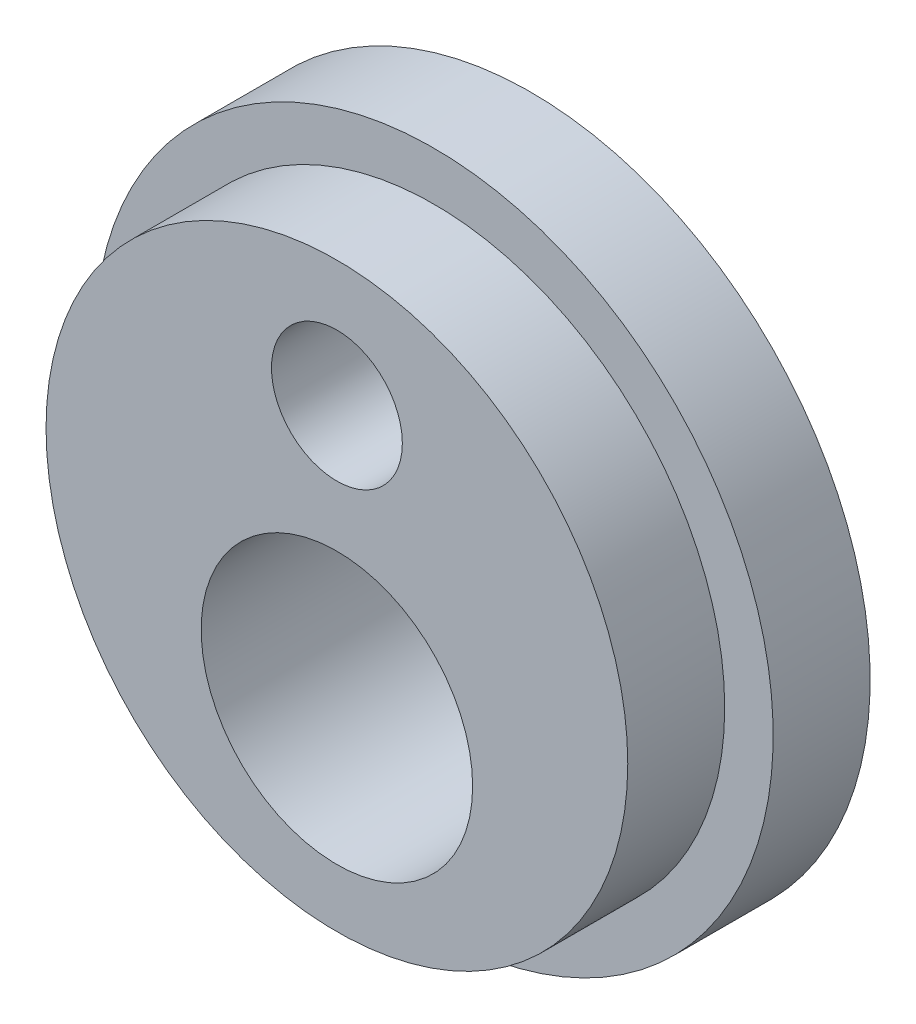
ISO-10303-21;
HEADER;
FILE_DESCRIPTION(('STEP AP214'),'2;1');
FILE_NAME('part.step','',(''),(''),'','','');
FILE_SCHEMA(('AUTOMOTIVE_DESIGN { 1 0 10303 214 1 1 1 1 }'));
ENDSEC;
DATA;
#1=APPLICATION_CONTEXT('core data for automotive mechanical design processes');
#2=APPLICATION_PROTOCOL_DEFINITION('international standard','automotive_design',2000,#1);
#3=PRODUCT_CONTEXT('',#1,'mechanical');
#4=PRODUCT('Part','Part','',(#3));
#5=PRODUCT_RELATED_PRODUCT_CATEGORY('part','',(#4));
#6=PRODUCT_DEFINITION_FORMATION('','',#4);
#7=PRODUCT_DEFINITION_CONTEXT('part definition',#1,'design');
#8=PRODUCT_DEFINITION('design','',#6,#7);
#9=PRODUCT_DEFINITION_SHAPE('','',#8);
#10=(LENGTH_UNIT() NAMED_UNIT(*) SI_UNIT(.MILLI.,.METRE.));
#11=(NAMED_UNIT(*) PLANE_ANGLE_UNIT() SI_UNIT($,.RADIAN.));
#12=(NAMED_UNIT(*) SI_UNIT($,.STERADIAN.) SOLID_ANGLE_UNIT());
#13=UNCERTAINTY_MEASURE_WITH_UNIT(LENGTH_MEASURE(1.E-05),#10,'distance_accuracy_value','');
#14=(GEOMETRIC_REPRESENTATION_CONTEXT(3) GLOBAL_UNCERTAINTY_ASSIGNED_CONTEXT((#13)) GLOBAL_UNIT_ASSIGNED_CONTEXT((#10,
#11,#12)) REPRESENTATION_CONTEXT('',''));
#15=CARTESIAN_POINT('',(0.,0.,0.));
#16=DIRECTION('',(0.,0.,1.));
#17=DIRECTION('',(1.,0.,0.));
#18=AXIS2_PLACEMENT_3D('',#15,#16,#17);
#19=CARTESIAN_POINT('',(0.,-1.66533453693773E-13,12.7));
#20=DIRECTION('',(0.,0.,-0.999999999999999));
#21=DIRECTION('',(-1.,0.,0.));
#22=AXIS2_PLACEMENT_3D('',#19,#20,#21);
#23=CYLINDRICAL_SURFACE('',#22,44.45);
#24=CARTESIAN_POINT('',(0.,-1.66533453693773E-13,12.7));
#25=DIRECTION('',(0.,0.,0.999999999999999));
#26=DIRECTION('',(1.,0.,0.));
#27=AXIS2_PLACEMENT_3D('',#24,#25,#26);
#28=CIRCLE('',#27,44.45);
#29=CARTESIAN_POINT('',(-44.45,-1.66533453693774E-13,12.7));
#30=VERTEX_POINT('',#29);
#31=EDGE_CURVE('E39',#30,#30,#28,.T.);
#32=CARTESIAN_POINT('',(0.,0.,0.));
#33=DIRECTION('',(0.,0.,0.999999999999999));
#34=DIRECTION('',(1.,0.,0.));
#35=AXIS2_PLACEMENT_3D('',#32,#33,#34);
#36=CIRCLE('',#35,44.45);
#37=CARTESIAN_POINT('',(-44.45,-1.66533453693774E-13,0.));
#38=VERTEX_POINT('',#37);
#39=EDGE_CURVE('E44',#38,#38,#36,.T.);
#40=CARTESIAN_POINT('',(-44.45,-1.66533453693774E-13,12.7));
#41=CARTESIAN_POINT('',(-44.45,-1.66533453693774E-13,12.5677083333333));
#42=CARTESIAN_POINT('',(-44.45,-1.66533453693774E-13,12.4354166666667));
#43=CARTESIAN_POINT('',(-44.45,-1.66533453693774E-13,12.1708333333333));
#44=CARTESIAN_POINT('',(-44.45,-1.66533453693774E-13,12.0385416666667));
#45=CARTESIAN_POINT('',(-44.45,-1.66533453693774E-13,11.7739583333333));
#46=CARTESIAN_POINT('',(-44.45,-1.66533453693774E-13,11.6416666666667));
#47=CARTESIAN_POINT('',(-44.45,-1.66533453693774E-13,11.3770833333333));
#48=CARTESIAN_POINT('',(-44.45,-1.66533453693774E-13,11.2447916666667));
#49=CARTESIAN_POINT('',(-44.45,-1.66533453693774E-13,10.9802083333333));
#50=CARTESIAN_POINT('',(-44.45,-1.66533453693774E-13,10.8479166666667));
#51=CARTESIAN_POINT('',(-44.45,-1.66533453693774E-13,10.5833333333333));
#52=CARTESIAN_POINT('',(-44.45,-1.66533453693774E-13,10.4510416666667));
#53=CARTESIAN_POINT('',(-44.45,-1.66533453693774E-13,10.1864583333333));
#54=CARTESIAN_POINT('',(-44.45,-1.66533453693774E-13,10.0541666666667));
#55=CARTESIAN_POINT('',(-44.45,-1.66533453693774E-13,9.78958333333334));
#56=CARTESIAN_POINT('',(-44.45,-1.66533453693774E-13,9.65729166666667));
#57=CARTESIAN_POINT('',(-44.45,-1.66533453693774E-13,9.39270833333333));
#58=CARTESIAN_POINT('',(-44.45,-1.66533453693774E-13,9.26041666666667));
#59=CARTESIAN_POINT('',(-44.45,-1.66533453693774E-13,8.99583333333334));
#60=CARTESIAN_POINT('',(-44.45,-1.66533453693774E-13,8.86354166666667));
#61=CARTESIAN_POINT('',(-44.45,-1.66533453693774E-13,8.59895833333334));
#62=CARTESIAN_POINT('',(-44.45,-1.66533453693774E-13,8.46666666666667));
#63=CARTESIAN_POINT('',(-44.45,-1.66533453693774E-13,8.20208333333333));
#64=CARTESIAN_POINT('',(-44.45,-1.66533453693774E-13,8.06979166666667));
#65=CARTESIAN_POINT('',(-44.45,-1.66533453693774E-13,7.80520833333333));
#66=CARTESIAN_POINT('',(-44.45,-1.66533453693774E-13,7.67291666666667));
#67=CARTESIAN_POINT('',(-44.45,-1.66533453693774E-13,7.40833333333333));
#68=CARTESIAN_POINT('',(-44.45,-1.66533453693774E-13,7.27604166666667));
#69=CARTESIAN_POINT('',(-44.45,-1.66533453693774E-13,7.01145833333333));
#70=CARTESIAN_POINT('',(-44.45,-1.66533453693774E-13,6.87916666666667));
#71=CARTESIAN_POINT('',(-44.45,-1.66533453693774E-13,6.61458333333333));
#72=CARTESIAN_POINT('',(-44.45,-1.66533453693774E-13,6.48229166666667));
#73=CARTESIAN_POINT('',(-44.45,-1.66533453693774E-13,6.21770833333333));
#74=CARTESIAN_POINT('',(-44.45,-1.66533453693774E-13,6.08541666666667));
#75=CARTESIAN_POINT('',(-44.45,-1.66533453693774E-13,5.82083333333333));
#76=CARTESIAN_POINT('',(-44.45,-1.66533453693774E-13,5.68854166666667));
#77=CARTESIAN_POINT('',(-44.45,-1.66533453693774E-13,5.42395833333333));
#78=CARTESIAN_POINT('',(-44.45,-1.66533453693774E-13,5.29166666666667));
#79=CARTESIAN_POINT('',(-44.45,-1.66533453693774E-13,5.02708333333333));
#80=CARTESIAN_POINT('',(-44.45,-1.66533453693774E-13,4.89479166666667));
#81=CARTESIAN_POINT('',(-44.45,-1.66533453693774E-13,4.63020833333333));
#82=CARTESIAN_POINT('',(-44.45,-1.66533453693774E-13,4.49791666666667));
#83=CARTESIAN_POINT('',(-44.45,-1.66533453693774E-13,4.23333333333333));
#84=CARTESIAN_POINT('',(-44.45,-1.66533453693774E-13,4.10104166666667));
#85=CARTESIAN_POINT('',(-44.45,-1.66533453693774E-13,3.83645833333333));
#86=CARTESIAN_POINT('',(-44.45,-1.66533453693774E-13,3.70416666666667));
#87=CARTESIAN_POINT('',(-44.45,-1.66533453693774E-13,3.43958333333333));
#88=CARTESIAN_POINT('',(-44.45,-1.66533453693774E-13,3.30729166666667));
#89=CARTESIAN_POINT('',(-44.45,-1.66533453693774E-13,3.04270833333333));
#90=CARTESIAN_POINT('',(-44.45,-1.66533453693774E-13,2.91041666666667));
#91=CARTESIAN_POINT('',(-44.45,-1.66533453693774E-13,2.64583333333333));
#92=CARTESIAN_POINT('',(-44.45,-1.66533453693774E-13,2.51354166666667));
#93=CARTESIAN_POINT('',(-44.45,-1.66533453693774E-13,2.24895833333333));
#94=CARTESIAN_POINT('',(-44.45,-1.66533453693774E-13,2.11666666666666));
#95=CARTESIAN_POINT('',(-44.45,-1.66533453693774E-13,1.85208333333333));
#96=CARTESIAN_POINT('',(-44.45,-1.66533453693774E-13,1.71979166666667));
#97=CARTESIAN_POINT('',(-44.45,-1.66533453693774E-13,1.45520833333333));
#98=CARTESIAN_POINT('',(-44.45,-1.66533453693774E-13,1.32291666666666));
#99=CARTESIAN_POINT('',(-44.45,-1.66533453693774E-13,1.05833333333333));
#100=CARTESIAN_POINT('',(-44.45,-1.66533453693774E-13,0.926041666666665));
#101=CARTESIAN_POINT('',(-44.45,-1.66533453693774E-13,0.661458333333332));
#102=CARTESIAN_POINT('',(-44.45,-1.66533453693774E-13,0.529166666666665));
#103=CARTESIAN_POINT('',(-44.45,-1.66533453693774E-13,0.264583333333331));
#104=CARTESIAN_POINT('',(-44.45,-1.66533453693774E-13,0.132291666666665));
#105=CARTESIAN_POINT('',(-44.45,-1.66533453693774E-13,0.));
#106=B_SPLINE_CURVE_WITH_KNOTS('',3,(#40,#41,#42,#43,#44,#45,#46,#47,#48,#49,#50,#51,#52,#53,
#54,#55,#56,#57,#58,#59,#60,#61,#62,#63,#64,#65,#66,#67,#68,#69,#70,#71,#72,#73,#74,#75,#76,#77,
#78,#79,#80,#81,#82,#83,#84,#85,#86,#87,#88,#89,#90,#91,#92,#93,#94,#95,#96,#97,#98,#99,#100,
#101,#102,#103,#104,#105),.UNSPECIFIED.,.F.,.F.,(4,2,2,2,2,2,2,2,2,2,2,2,2,2,2,2,2,2,2,2,2,2,2,
2,2,2,2,2,2,2,2,2,4),(0.,0.396875,0.793749999999999,1.190625,1.5875,1.984375,2.38125,2.778125,
3.175,3.571875,3.96875,4.365625,4.7625,5.159375,5.55625,5.953125,6.35,6.746875,7.14375,7.540625,
7.9375,8.334375,8.73125,9.128125,9.525,9.921875,10.31875,10.715625,11.1125,11.509375,11.90625,
12.303125,12.7),.UNSPECIFIED.);
#107=EDGE_CURVE('BSEAM32',#30,#38,#106,.T.);
#108=ORIENTED_EDGE('',*,*,#31,.F.);
#109=ORIENTED_EDGE('',*,*,#39,.T.);
#110=ORIENTED_EDGE('',*,*,#107,.T.);
#111=ORIENTED_EDGE('',*,*,#107,.F.);
#112=EDGE_LOOP('',(#108,#110,#109,#111));
#113=FACE_BOUND('',#112,.T.);
#114=ADVANCED_FACE('F32',(#113),#23,.T.);
#115=CARTESIAN_POINT('',(0.,-1.66533453693773E-13,12.7));
#116=DIRECTION('',(0.,0.,0.999999999999999));
#117=DIRECTION('',(1.,0.,0.));
#118=AXIS2_PLACEMENT_3D('',#115,#116,#117);
#119=PLANE('',#118);
#120=CARTESIAN_POINT('',(0.,-1.66533453693773E-13,12.7));
#121=DIRECTION('',(0.,0.,0.999999999999999));
#122=DIRECTION('',(1.,0.,0.));
#123=AXIS2_PLACEMENT_3D('',#120,#121,#122);
#124=CIRCLE('',#123,38.1);
#125=CARTESIAN_POINT('',(-38.1,-1.66533453693774E-13,12.7));
#126=VERTEX_POINT('',#125);
#127=EDGE_CURVE('E10',#126,#126,#124,.T.);
#128=ORIENTED_EDGE('',*,*,#127,.F.);
#129=EDGE_LOOP('',(#128));
#130=FACE_BOUND('',#129,.T.);
#131=ORIENTED_EDGE('',*,*,#31,.T.);
#132=EDGE_LOOP('',(#131));
#133=FACE_BOUND('',#132,.T.);
#134=ADVANCED_FACE('F91',(#130,#133),#119,.T.);
#135=CARTESIAN_POINT('',(0.,0.,0.));
#136=DIRECTION('',(0.,0.,0.999999999999999));
#137=DIRECTION('',(1.,0.,0.));
#138=AXIS2_PLACEMENT_3D('',#135,#136,#137);
#139=PLANE('',#138);
#140=CARTESIAN_POINT('',(-27.94,-12.7,0.));
#141=DIRECTION('',(0.,0.,-0.999999999999999));
#142=DIRECTION('',(-1.,0.,0.));
#143=AXIS2_PLACEMENT_3D('',#140,#141,#142);
#144=CIRCLE('',#143,3.175);
#145=CARTESIAN_POINT('',(-31.1149999999999,-12.7,0.));
#146=VERTEX_POINT('',#145);
#147=EDGE_CURVE('E72',#146,#146,#144,.T.);
#148=ORIENTED_EDGE('',*,*,#147,.F.);
#149=EDGE_LOOP('',(#148));
#150=FACE_BOUND('',#149,.T.);
#151=CARTESIAN_POINT('',(27.94,-12.6999999999999,0.));
#152=DIRECTION('',(0.,0.,-0.999999999999999));
#153=DIRECTION('',(-1.,0.,0.));
#154=AXIS2_PLACEMENT_3D('',#151,#152,#153);
#155=CIRCLE('',#154,3.175);
#156=CARTESIAN_POINT('',(24.765,-12.7,0.));
#157=VERTEX_POINT('',#156);
#158=EDGE_CURVE('E66',#157,#157,#155,.T.);
#159=ORIENTED_EDGE('',*,*,#158,.F.);
#160=EDGE_LOOP('',(#159));
#161=FACE_BOUND('',#160,.T.);
#162=CARTESIAN_POINT('',(0.,-12.7,0.));
#163=DIRECTION('',(0.,0.,0.999999999999999));
#164=DIRECTION('',(1.,0.,0.));
#165=AXIS2_PLACEMENT_3D('',#162,#163,#164);
#166=CIRCLE('',#165,17.78);
#167=CARTESIAN_POINT('',(17.78,-12.7,0.));
#168=VERTEX_POINT('',#167);
#169=EDGE_CURVE('E61',#168,#168,#166,.T.);
#170=ORIENTED_EDGE('',*,*,#169,.T.);
#171=EDGE_LOOP('',(#170));
#172=FACE_BOUND('',#171,.T.);
#173=CARTESIAN_POINT('',(0.,21.59,0.));
#174=DIRECTION('',(0.,0.,0.999999999999999));
#175=DIRECTION('',(1.,0.,0.));
#176=AXIS2_PLACEMENT_3D('',#173,#174,#175);
#177=CIRCLE('',#176,8.5725);
#178=CARTESIAN_POINT('',(8.5725,21.59,0.));
#179=VERTEX_POINT('',#178);
#180=EDGE_CURVE('E53',#179,#179,#177,.T.);
#181=ORIENTED_EDGE('',*,*,#180,.T.);
#182=EDGE_LOOP('',(#181));
#183=FACE_BOUND('',#182,.T.);
#184=ORIENTED_EDGE('',*,*,#39,.F.);
#185=EDGE_LOOP('',(#184));
#186=FACE_BOUND('',#185,.T.);
#187=ADVANCED_FACE('F87',(#150,#161,#172,#183,#186),#139,.F.);
#188=CARTESIAN_POINT('',(0.,-1.66533453693773E-13,25.4));
#189=DIRECTION('',(0.,0.,-0.999999999999999));
#190=DIRECTION('',(-1.,0.,0.));
#191=AXIS2_PLACEMENT_3D('',#188,#189,#190);
#192=CYLINDRICAL_SURFACE('',#191,38.1);
#193=CARTESIAN_POINT('',(0.,-1.66533453693773E-13,25.4));
#194=DIRECTION('',(0.,0.,0.999999999999999));
#195=DIRECTION('',(1.,0.,0.));
#196=AXIS2_PLACEMENT_3D('',#193,#194,#195);
#197=CIRCLE('',#196,38.1);
#198=CARTESIAN_POINT('',(-38.1,-1.66533453693774E-13,25.4));
#199=VERTEX_POINT('',#198);
#200=EDGE_CURVE('E47',#199,#199,#197,.T.);
#201=CARTESIAN_POINT('',(-38.1,-1.66533453693774E-13,25.4));
#202=CARTESIAN_POINT('',(-38.1,-1.66533453693774E-13,25.2677083333333));
#203=CARTESIAN_POINT('',(-38.1,-1.66533453693774E-13,25.1354166666667));
#204=CARTESIAN_POINT('',(-38.1,-1.66533453693774E-13,24.8708333333333));
#205=CARTESIAN_POINT('',(-38.1,-1.66533453693774E-13,24.7385416666667));
#206=CARTESIAN_POINT('',(-38.1,-1.66533453693774E-13,24.4739583333333));
#207=CARTESIAN_POINT('',(-38.1,-1.66533453693774E-13,24.3416666666667));
#208=CARTESIAN_POINT('',(-38.1,-1.66533453693774E-13,24.0770833333333));
#209=CARTESIAN_POINT('',(-38.1,-1.66533453693774E-13,23.9447916666667));
#210=CARTESIAN_POINT('',(-38.1,-1.66533453693774E-13,23.6802083333333));
#211=CARTESIAN_POINT('',(-38.1,-1.66533453693774E-13,23.5479166666667));
#212=CARTESIAN_POINT('',(-38.1,-1.66533453693774E-13,23.2833333333333));
#213=CARTESIAN_POINT('',(-38.1,-1.66533453693774E-13,23.1510416666667));
#214=CARTESIAN_POINT('',(-38.1,-1.66533453693774E-13,22.8864583333333));
#215=CARTESIAN_POINT('',(-38.1,-1.66533453693774E-13,22.7541666666667));
#216=CARTESIAN_POINT('',(-38.1,-1.66533453693774E-13,22.4895833333333));
#217=CARTESIAN_POINT('',(-38.1,-1.66533453693774E-13,22.3572916666667));
#218=CARTESIAN_POINT('',(-38.1,-1.66533453693774E-13,22.0927083333333));
#219=CARTESIAN_POINT('',(-38.1,-1.66533453693774E-13,21.9604166666667));
#220=CARTESIAN_POINT('',(-38.1,-1.66533453693774E-13,21.6958333333333));
#221=CARTESIAN_POINT('',(-38.1,-1.66533453693774E-13,21.5635416666667));
#222=CARTESIAN_POINT('',(-38.1,-1.66533453693774E-13,21.2989583333333));
#223=CARTESIAN_POINT('',(-38.1,-1.66533453693774E-13,21.1666666666667));
#224=CARTESIAN_POINT('',(-38.1,-1.66533453693774E-13,20.9020833333333));
#225=CARTESIAN_POINT('',(-38.1,-1.66533453693774E-13,20.7697916666667));
#226=CARTESIAN_POINT('',(-38.1,-1.66533453693774E-13,20.5052083333333));
#227=CARTESIAN_POINT('',(-38.1,-1.66533453693774E-13,20.3729166666667));
#228=CARTESIAN_POINT('',(-38.1,-1.66533453693774E-13,20.1083333333333));
#229=CARTESIAN_POINT('',(-38.1,-1.66533453693774E-13,19.9760416666667));
#230=CARTESIAN_POINT('',(-38.1,-1.66533453693774E-13,19.7114583333333));
#231=CARTESIAN_POINT('',(-38.1,-1.66533453693774E-13,19.5791666666667));
#232=CARTESIAN_POINT('',(-38.1,-1.66533453693774E-13,19.3145833333333));
#233=CARTESIAN_POINT('',(-38.1,-1.66533453693774E-13,19.1822916666667));
#234=CARTESIAN_POINT('',(-38.1,-1.66533453693774E-13,18.9177083333333));
#235=CARTESIAN_POINT('',(-38.1,-1.66533453693774E-13,18.7854166666667));
#236=CARTESIAN_POINT('',(-38.1,-1.66533453693774E-13,18.5208333333333));
#237=CARTESIAN_POINT('',(-38.1,-1.66533453693774E-13,18.3885416666667));
#238=CARTESIAN_POINT('',(-38.1,-1.66533453693774E-13,18.1239583333333));
#239=CARTESIAN_POINT('',(-38.1,-1.66533453693774E-13,17.9916666666667));
#240=CARTESIAN_POINT('',(-38.1,-1.66533453693774E-13,17.7270833333333));
#241=CARTESIAN_POINT('',(-38.1,-1.66533453693774E-13,17.5947916666667));
#242=CARTESIAN_POINT('',(-38.1,-1.66533453693774E-13,17.3302083333333));
#243=CARTESIAN_POINT('',(-38.1,-1.66533453693774E-13,17.1979166666667));
#244=CARTESIAN_POINT('',(-38.1,-1.66533453693774E-13,16.9333333333333));
#245=CARTESIAN_POINT('',(-38.1,-1.66533453693774E-13,16.8010416666667));
#246=CARTESIAN_POINT('',(-38.1,-1.66533453693774E-13,16.5364583333333));
#247=CARTESIAN_POINT('',(-38.1,-1.66533453693774E-13,16.4041666666667));
#248=CARTESIAN_POINT('',(-38.1,-1.66533453693774E-13,16.1395833333333));
#249=CARTESIAN_POINT('',(-38.1,-1.66533453693774E-13,16.0072916666667));
#250=CARTESIAN_POINT('',(-38.1,-1.66533453693774E-13,15.7427083333333));
#251=CARTESIAN_POINT('',(-38.1,-1.66533453693774E-13,15.6104166666667));
#252=CARTESIAN_POINT('',(-38.1,-1.66533453693774E-13,15.3458333333333));
#253=CARTESIAN_POINT('',(-38.1,-1.66533453693774E-13,15.2135416666667));
#254=CARTESIAN_POINT('',(-38.1,-1.66533453693774E-13,14.9489583333333));
#255=CARTESIAN_POINT('',(-38.1,-1.66533453693774E-13,14.8166666666667));
#256=CARTESIAN_POINT('',(-38.1,-1.66533453693774E-13,14.5520833333333));
#257=CARTESIAN_POINT('',(-38.1,-1.66533453693774E-13,14.4197916666667));
#258=CARTESIAN_POINT('',(-38.1,-1.66533453693774E-13,14.1552083333333));
#259=CARTESIAN_POINT('',(-38.1,-1.66533453693774E-13,14.0229166666667));
#260=CARTESIAN_POINT('',(-38.1,-1.66533453693774E-13,13.7583333333333));
#261=CARTESIAN_POINT('',(-38.1,-1.66533453693774E-13,13.6260416666667));
#262=CARTESIAN_POINT('',(-38.1,-1.66533453693774E-13,13.3614583333333));
#263=CARTESIAN_POINT('',(-38.1,-1.66533453693774E-13,13.2291666666667));
#264=CARTESIAN_POINT('',(-38.1,-1.66533453693774E-13,12.9645833333333));
#265=CARTESIAN_POINT('',(-38.1,-1.66533453693774E-13,12.8322916666667));
#266=CARTESIAN_POINT('',(-38.1,-1.66533453693774E-13,12.7));
#267=B_SPLINE_CURVE_WITH_KNOTS('',3,(#201,#202,#203,#204,#205,#206,#207,#208,#209,#210,#211,
#212,#213,#214,#215,#216,#217,#218,#219,#220,#221,#222,#223,#224,#225,#226,#227,#228,#229,#230,
#231,#232,#233,#234,#235,#236,#237,#238,#239,#240,#241,#242,#243,#244,#245,#246,#247,#248,#249,
#250,#251,#252,#253,#254,#255,#256,#257,#258,#259,#260,#261,#262,#263,#264,#265,#266),
.UNSPECIFIED.,.F.,.F.,(4,2,2,2,2,2,2,2,2,2,2,2,2,2,2,2,2,2,2,2,2,2,2,2,2,2,2,2,2,2,2,2,4),(0.,
0.396875000000001,0.793750000000003,1.190625,1.5875,1.984375,2.38125,2.778125,3.175,3.571875,
3.96875,4.365625,4.7625,5.159375,5.55625,5.953125,6.34999999999999,6.746875,7.14375,7.540625,
7.93749999999999,8.33437499999999,8.73125,9.12812499999999,9.52499999999999,9.92187499999999,
10.31875,10.715625,11.1125,11.509375,11.90625,12.303125,12.7),.UNSPECIFIED.);
#268=EDGE_CURVE('BSEAM90',#199,#126,#267,.T.);
#269=ORIENTED_EDGE('',*,*,#200,.F.);
#270=ORIENTED_EDGE('',*,*,#127,.T.);
#271=ORIENTED_EDGE('',*,*,#268,.T.);
#272=ORIENTED_EDGE('',*,*,#268,.F.);
#273=EDGE_LOOP('',(#269,#271,#270,#272));
#274=FACE_BOUND('',#273,.T.);
#275=ADVANCED_FACE('F90',(#274),#192,.T.);
#276=CARTESIAN_POINT('',(0.,-1.66533453693773E-13,25.4));
#277=DIRECTION('',(0.,0.,0.999999999999999));
#278=DIRECTION('',(1.,0.,0.));
#279=AXIS2_PLACEMENT_3D('',#276,#277,#278);
#280=PLANE('',#279);
#281=CARTESIAN_POINT('',(1.66533453693773E-13,-12.7000000000002,25.3999999999999));
#282=DIRECTION('',(0.,0.,0.999999999999999));
#283=DIRECTION('',(1.,0.,0.));
#284=AXIS2_PLACEMENT_3D('',#281,#282,#283);
#285=CIRCLE('',#284,17.78);
#286=CARTESIAN_POINT('',(17.78,-12.7,25.3999999999999));
#287=VERTEX_POINT('',#286);
#288=EDGE_CURVE('E35',#287,#287,#285,.T.);
#289=ORIENTED_EDGE('',*,*,#288,.F.);
#290=EDGE_LOOP('',(#289));
#291=FACE_BOUND('',#290,.T.);
#292=CARTESIAN_POINT('',(0.,21.5899999999998,25.3999999999999));
#293=DIRECTION('',(0.,0.,0.999999999999999));
#294=DIRECTION('',(1.,0.,0.));
#295=AXIS2_PLACEMENT_3D('',#292,#293,#294);
#296=CIRCLE('',#295,8.5725);
#297=CARTESIAN_POINT('',(8.5725,21.59,25.3999999999999));
#298=VERTEX_POINT('',#297);
#299=EDGE_CURVE('E51',#298,#298,#296,.T.);
#300=ORIENTED_EDGE('',*,*,#299,.F.);
#301=EDGE_LOOP('',(#300));
#302=FACE_BOUND('',#301,.T.);
#303=ORIENTED_EDGE('',*,*,#200,.T.);
#304=EDGE_LOOP('',(#303));
#305=FACE_BOUND('',#304,.T.);
#306=ADVANCED_FACE('F112',(#291,#302,#305),#280,.T.);
#307=CARTESIAN_POINT('',(0.,21.59,0.));
#308=DIRECTION('',(0.,0.,0.999999999999999));
#309=DIRECTION('',(1.,0.,0.));
#310=AXIS2_PLACEMENT_3D('',#307,#308,#309);
#311=CYLINDRICAL_SURFACE('',#310,8.5725);
#312=CARTESIAN_POINT('',(8.5725,21.59,25.3999999999999));
#313=CARTESIAN_POINT('',(8.5725,21.59,25.1354166666666));
#314=CARTESIAN_POINT('',(8.5725,21.59,24.8708333333333));
#315=CARTESIAN_POINT('',(8.5725,21.59,24.3416666666666));
#316=CARTESIAN_POINT('',(8.5725,21.59,24.0770833333333));
#317=CARTESIAN_POINT('',(8.5725,21.59,23.5479166666666));
#318=CARTESIAN_POINT('',(8.5725,21.59,23.2833333333333));
#319=CARTESIAN_POINT('',(8.5725,21.59,22.7541666666666));
#320=CARTESIAN_POINT('',(8.5725,21.59,22.4895833333333));
#321=CARTESIAN_POINT('',(8.5725,21.59,21.9604166666666));
#322=CARTESIAN_POINT('',(8.5725,21.59,21.6958333333333));
#323=CARTESIAN_POINT('',(8.5725,21.59,21.1666666666666));
#324=CARTESIAN_POINT('',(8.5725,21.59,20.9020833333333));
#325=CARTESIAN_POINT('',(8.5725,21.59,20.3729166666666));
#326=CARTESIAN_POINT('',(8.5725,21.59,20.1083333333333));
#327=CARTESIAN_POINT('',(8.5725,21.59,19.5791666666666));
#328=CARTESIAN_POINT('',(8.5725,21.59,19.3145833333333));
#329=CARTESIAN_POINT('',(8.5725,21.59,18.7854166666666));
#330=CARTESIAN_POINT('',(8.5725,21.59,18.5208333333333));
#331=CARTESIAN_POINT('',(8.5725,21.59,17.9916666666666));
#332=CARTESIAN_POINT('',(8.5725,21.59,17.7270833333333));
#333=CARTESIAN_POINT('',(8.5725,21.59,17.1979166666666));
#334=CARTESIAN_POINT('',(8.5725,21.59,16.9333333333333));
#335=CARTESIAN_POINT('',(8.5725,21.59,16.4041666666666));
#336=CARTESIAN_POINT('',(8.5725,21.59,16.1395833333333));
#337=CARTESIAN_POINT('',(8.5725,21.59,15.6104166666666));
#338=CARTESIAN_POINT('',(8.5725,21.59,15.3458333333333));
#339=CARTESIAN_POINT('',(8.5725,21.59,14.8166666666667));
#340=CARTESIAN_POINT('',(8.5725,21.59,14.5520833333333));
#341=CARTESIAN_POINT('',(8.5725,21.59,14.0229166666667));
#342=CARTESIAN_POINT('',(8.5725,21.59,13.7583333333333));
#343=CARTESIAN_POINT('',(8.5725,21.59,13.2291666666667));
#344=CARTESIAN_POINT('',(8.5725,21.59,12.9645833333333));
#345=CARTESIAN_POINT('',(8.5725,21.59,12.4354166666667));
#346=CARTESIAN_POINT('',(8.5725,21.59,12.1708333333333));
#347=CARTESIAN_POINT('',(8.5725,21.59,11.6416666666667));
#348=CARTESIAN_POINT('',(8.5725,21.59,11.3770833333333));
#349=CARTESIAN_POINT('',(8.5725,21.59,10.8479166666667));
#350=CARTESIAN_POINT('',(8.5725,21.59,10.5833333333333));
#351=CARTESIAN_POINT('',(8.5725,21.59,10.0541666666667));
#352=CARTESIAN_POINT('',(8.5725,21.59,9.78958333333333));
#353=CARTESIAN_POINT('',(8.5725,21.59,9.26041666666667));
#354=CARTESIAN_POINT('',(8.5725,21.59,8.99583333333334));
#355=CARTESIAN_POINT('',(8.5725,21.59,8.46666666666667));
#356=CARTESIAN_POINT('',(8.5725,21.59,8.20208333333334));
#357=CARTESIAN_POINT('',(8.5725,21.59,7.67291666666668));
#358=CARTESIAN_POINT('',(8.5725,21.59,7.40833333333335));
#359=CARTESIAN_POINT('',(8.5725,21.59,6.87916666666668));
#360=CARTESIAN_POINT('',(8.5725,21.59,6.61458333333335));
#361=CARTESIAN_POINT('',(8.5725,21.59,6.08541666666668));
#362=CARTESIAN_POINT('',(8.5725,21.59,5.82083333333335));
#363=CARTESIAN_POINT('',(8.5725,21.59,5.29166666666669));
#364=CARTESIAN_POINT('',(8.5725,21.59,5.02708333333336));
#365=CARTESIAN_POINT('',(8.5725,21.59,4.49791666666669));
#366=CARTESIAN_POINT('',(8.5725,21.59,4.23333333333336));
#367=CARTESIAN_POINT('',(8.5725,21.59,3.70416666666669));
#368=CARTESIAN_POINT('',(8.5725,21.59,3.43958333333336));
#369=CARTESIAN_POINT('',(8.5725,21.59,2.9104166666667));
#370=CARTESIAN_POINT('',(8.5725,21.59,2.64583333333336));
#371=CARTESIAN_POINT('',(8.5725,21.59,2.1166666666667));
#372=CARTESIAN_POINT('',(8.5725,21.59,1.85208333333337));
#373=CARTESIAN_POINT('',(8.5725,21.59,1.3229166666667));
#374=CARTESIAN_POINT('',(8.5725,21.59,1.05833333333337));
#375=CARTESIAN_POINT('',(8.5725,21.59,0.529166666666705));
#376=CARTESIAN_POINT('',(8.5725,21.59,0.264583333333374));
#377=CARTESIAN_POINT('',(8.5725,21.59,0.));
#378=B_SPLINE_CURVE_WITH_KNOTS('',3,(#312,#313,#314,#315,#316,#317,#318,#319,#320,#321,#322,
#323,#324,#325,#326,#327,#328,#329,#330,#331,#332,#333,#334,#335,#336,#337,#338,#339,#340,#341,
#342,#343,#344,#345,#346,#347,#348,#349,#350,#351,#352,#353,#354,#355,#356,#357,#358,#359,#360,
#361,#362,#363,#364,#365,#366,#367,#368,#369,#370,#371,#372,#373,#374,#375,#376,#377),
.UNSPECIFIED.,.F.,.F.,(4,2,2,2,2,2,2,2,2,2,2,2,2,2,2,2,2,2,2,2,2,2,2,2,2,2,2,2,2,2,2,2,4),(0.,
0.793749999999996,1.5875,2.38124999999999,3.17499999999999,3.96874999999998,4.76249999999998,
5.55624999999998,6.34999999999998,7.14374999999997,7.93749999999997,8.73124999999997,
9.52499999999996,10.31875,11.1125,11.90625,12.6999999999999,13.4937499999999,14.2874999999999,
15.0812499999999,15.8749999999999,16.6687499999999,17.4624999999999,18.2562499999999,
19.0499999999999,19.8437499999999,20.6374999999999,21.4312499999999,22.2249999999999,
23.0187499999999,23.8124999999999,24.6062499999999,25.3999999999999),.UNSPECIFIED.);
#379=EDGE_CURVE('BSEAM116',#298,#179,#378,.T.);
#380=ORIENTED_EDGE('',*,*,#299,.T.);
#381=ORIENTED_EDGE('',*,*,#180,.F.);
#382=ORIENTED_EDGE('',*,*,#379,.T.);
#383=ORIENTED_EDGE('',*,*,#379,.F.);
#384=EDGE_LOOP('',(#380,#382,#381,#383));
#385=FACE_BOUND('',#384,.T.);
#386=ADVANCED_FACE('F116',(#385),#311,.F.);
#387=CARTESIAN_POINT('',(0.,-12.7,0.));
#388=DIRECTION('',(0.,0.,0.999999999999999));
#389=DIRECTION('',(1.,0.,0.));
#390=AXIS2_PLACEMENT_3D('',#387,#388,#389);
#391=CYLINDRICAL_SURFACE('',#390,17.78);
#392=CARTESIAN_POINT('',(17.78,-12.7,25.3999999999999));
#393=CARTESIAN_POINT('',(17.78,-12.7,25.1354166666666));
#394=CARTESIAN_POINT('',(17.78,-12.7,24.8708333333332));
#395=CARTESIAN_POINT('',(17.78,-12.7,24.3416666666666));
#396=CARTESIAN_POINT('',(17.78,-12.7,24.0770833333333));
#397=CARTESIAN_POINT('',(17.78,-12.7,23.5479166666666));
#398=CARTESIAN_POINT('',(17.78,-12.7,23.2833333333333));
#399=CARTESIAN_POINT('',(17.78,-12.7,22.7541666666666));
#400=CARTESIAN_POINT('',(17.78,-12.7,22.4895833333333));
#401=CARTESIAN_POINT('',(17.78,-12.7,21.9604166666666));
#402=CARTESIAN_POINT('',(17.78,-12.7,21.6958333333333));
#403=CARTESIAN_POINT('',(17.78,-12.7,21.1666666666666));
#404=CARTESIAN_POINT('',(17.78,-12.7,20.9020833333333));
#405=CARTESIAN_POINT('',(17.78,-12.7,20.3729166666666));
#406=CARTESIAN_POINT('',(17.78,-12.7,20.1083333333333));
#407=CARTESIAN_POINT('',(17.78,-12.7,19.5791666666666));
#408=CARTESIAN_POINT('',(17.78,-12.7,19.3145833333333));
#409=CARTESIAN_POINT('',(17.78,-12.7,18.7854166666666));
#410=CARTESIAN_POINT('',(17.78,-12.7,18.5208333333333));
#411=CARTESIAN_POINT('',(17.78,-12.7,17.9916666666666));
#412=CARTESIAN_POINT('',(17.78,-12.7,17.7270833333333));
#413=CARTESIAN_POINT('',(17.78,-12.7,17.1979166666666));
#414=CARTESIAN_POINT('',(17.78,-12.7,16.9333333333333));
#415=CARTESIAN_POINT('',(17.78,-12.7,16.4041666666666));
#416=CARTESIAN_POINT('',(17.78,-12.7,16.1395833333333));
#417=CARTESIAN_POINT('',(17.78,-12.7,15.6104166666666));
#418=CARTESIAN_POINT('',(17.78,-12.7,15.3458333333333));
#419=CARTESIAN_POINT('',(17.78,-12.7,14.8166666666666));
#420=CARTESIAN_POINT('',(17.78,-12.7,14.5520833333333));
#421=CARTESIAN_POINT('',(17.78,-12.7,14.0229166666666));
#422=CARTESIAN_POINT('',(17.78,-12.7,13.7583333333333));
#423=CARTESIAN_POINT('',(17.78,-12.7,13.2291666666666));
#424=CARTESIAN_POINT('',(17.78,-12.7,12.9645833333333));
#425=CARTESIAN_POINT('',(17.78,-12.7,12.4354166666666));
#426=CARTESIAN_POINT('',(17.78,-12.7,12.1708333333333));
#427=CARTESIAN_POINT('',(17.78,-12.7,11.6416666666666));
#428=CARTESIAN_POINT('',(17.78,-12.7,11.3770833333333));
#429=CARTESIAN_POINT('',(17.78,-12.7,10.8479166666667));
#430=CARTESIAN_POINT('',(17.78,-12.7,10.5833333333333));
#431=CARTESIAN_POINT('',(17.78,-12.7,10.0541666666667));
#432=CARTESIAN_POINT('',(17.78,-12.7,9.78958333333332));
#433=CARTESIAN_POINT('',(17.78,-12.7,9.26041666666666));
#434=CARTESIAN_POINT('',(17.78,-12.7,8.99583333333333));
#435=CARTESIAN_POINT('',(17.78,-12.7,8.46666666666667));
#436=CARTESIAN_POINT('',(17.78,-12.7,8.20208333333333));
#437=CARTESIAN_POINT('',(17.78,-12.7,7.67291666666667));
#438=CARTESIAN_POINT('',(17.78,-12.7,7.40833333333334));
#439=CARTESIAN_POINT('',(17.78,-12.7,6.87916666666668));
#440=CARTESIAN_POINT('',(17.78,-12.7,6.61458333333334));
#441=CARTESIAN_POINT('',(17.78,-12.7,6.08541666666668));
#442=CARTESIAN_POINT('',(17.78,-12.7,5.82083333333335));
#443=CARTESIAN_POINT('',(17.78,-12.7,5.29166666666668));
#444=CARTESIAN_POINT('',(17.78,-12.7,5.02708333333335));
#445=CARTESIAN_POINT('',(17.78,-12.7,4.49791666666668));
#446=CARTESIAN_POINT('',(17.78,-12.7,4.23333333333335));
#447=CARTESIAN_POINT('',(17.78,-12.7,3.70416666666669));
#448=CARTESIAN_POINT('',(17.78,-12.7,3.43958333333336));
#449=CARTESIAN_POINT('',(17.78,-12.7,2.91041666666669));
#450=CARTESIAN_POINT('',(17.78,-12.7,2.64583333333336));
#451=CARTESIAN_POINT('',(17.78,-12.7,2.1166666666667));
#452=CARTESIAN_POINT('',(17.78,-12.7,1.85208333333337));
#453=CARTESIAN_POINT('',(17.78,-12.7,1.3229166666667));
#454=CARTESIAN_POINT('',(17.78,-12.7,1.05833333333337));
#455=CARTESIAN_POINT('',(17.78,-12.7,0.529166666666705));
#456=CARTESIAN_POINT('',(17.78,-12.7,0.264583333333374));
#457=CARTESIAN_POINT('',(17.78,-12.7,0.));
#458=B_SPLINE_CURVE_WITH_KNOTS('',3,(#392,#393,#394,#395,#396,#397,#398,#399,#400,#401,#402,
#403,#404,#405,#406,#407,#408,#409,#410,#411,#412,#413,#414,#415,#416,#417,#418,#419,#420,#421,
#422,#423,#424,#425,#426,#427,#428,#429,#430,#431,#432,#433,#434,#435,#436,#437,#438,#439,#440,
#441,#442,#443,#444,#445,#446,#447,#448,#449,#450,#451,#452,#453,#454,#455,#456,#457),
.UNSPECIFIED.,.F.,.F.,(4,2,2,2,2,2,2,2,2,2,2,2,2,2,2,2,2,2,2,2,2,2,2,2,2,2,2,2,2,2,2,2,4),(0.,
0.793749999999996,1.58749999999999,2.38124999999998,3.17499999999998,3.96874999999998,
4.76249999999998,5.55624999999997,6.34999999999997,7.14374999999997,7.93749999999996,
8.73124999999995,9.52499999999995,10.3187499999999,11.1124999999999,11.9062499999999,
12.6999999999999,13.4937499999999,14.2874999999999,15.0812499999999,15.8749999999999,
16.6687499999999,17.4624999999999,18.2562499999999,19.0499999999999,19.8437499999999,
20.6374999999999,21.4312499999999,22.2249999999999,23.0187499999999,23.8124999999999,
24.6062499999999,25.3999999999999),.UNSPECIFIED.);
#459=EDGE_CURVE('BSEAM120',#287,#168,#458,.T.);
#460=ORIENTED_EDGE('',*,*,#288,.T.);
#461=ORIENTED_EDGE('',*,*,#169,.F.);
#462=ORIENTED_EDGE('',*,*,#459,.T.);
#463=ORIENTED_EDGE('',*,*,#459,.F.);
#464=EDGE_LOOP('',(#460,#462,#461,#463));
#465=FACE_BOUND('',#464,.T.);
#466=ADVANCED_FACE('F120',(#465),#391,.F.);
#467=CARTESIAN_POINT('',(27.94,-12.7,12.7));
#468=DIRECTION('',(0.,0.,-0.999999999999999));
#469=DIRECTION('',(-1.,0.,0.));
#470=AXIS2_PLACEMENT_3D('',#467,#468,#469);
#471=CYLINDRICAL_SURFACE('',#470,3.175);
#472=CARTESIAN_POINT('',(27.94,-12.7,12.7));
#473=DIRECTION('',(0.,0.,-0.999999999999999));
#474=DIRECTION('',(-1.,0.,0.));
#475=AXIS2_PLACEMENT_3D('',#472,#473,#474);
#476=CIRCLE('',#475,3.175);
#477=CARTESIAN_POINT('',(24.765,-12.7,12.7));
#478=VERTEX_POINT('',#477);
#479=EDGE_CURVE('E69',#478,#478,#476,.T.);
#480=CARTESIAN_POINT('',(24.765,-12.7,12.7));
#481=CARTESIAN_POINT('',(24.765,-12.7,12.5677083333334));
#482=CARTESIAN_POINT('',(24.765,-12.7,12.4354166666667));
#483=CARTESIAN_POINT('',(24.765,-12.7,12.1708333333334));
#484=CARTESIAN_POINT('',(24.765,-12.7,12.0385416666667));
#485=CARTESIAN_POINT('',(24.765,-12.7,11.7739583333334));
#486=CARTESIAN_POINT('',(24.765,-12.7,11.6416666666667));
#487=CARTESIAN_POINT('',(24.765,-12.7,11.3770833333334));
#488=CARTESIAN_POINT('',(24.765,-12.7,11.2447916666667));
#489=CARTESIAN_POINT('',(24.765,-12.7,10.9802083333334));
#490=CARTESIAN_POINT('',(24.765,-12.7,10.8479166666667));
#491=CARTESIAN_POINT('',(24.765,-12.7,10.5833333333334));
#492=CARTESIAN_POINT('',(24.765,-12.7,10.4510416666667));
#493=CARTESIAN_POINT('',(24.765,-12.7,10.1864583333334));
#494=CARTESIAN_POINT('',(24.765,-12.7,10.0541666666667));
#495=CARTESIAN_POINT('',(24.765,-12.7,9.78958333333336));
#496=CARTESIAN_POINT('',(24.765,-12.7,9.6572916666667));
#497=CARTESIAN_POINT('',(24.765,-12.7,9.39270833333337));
#498=CARTESIAN_POINT('',(24.765,-12.7,9.2604166666667));
#499=CARTESIAN_POINT('',(24.765,-12.7,8.99583333333337));
#500=CARTESIAN_POINT('',(24.765,-12.7,8.8635416666667));
#501=CARTESIAN_POINT('',(24.765,-12.7,8.59895833333337));
#502=CARTESIAN_POINT('',(24.765,-12.7,8.4666666666667));
#503=CARTESIAN_POINT('',(24.765,-12.7,8.20208333333337));
#504=CARTESIAN_POINT('',(24.765,-12.7,8.0697916666667));
#505=CARTESIAN_POINT('',(24.765,-12.7,7.80520833333337));
#506=CARTESIAN_POINT('',(24.765,-12.7,7.6729166666667));
#507=CARTESIAN_POINT('',(24.765,-12.7,7.40833333333337));
#508=CARTESIAN_POINT('',(24.765,-12.7,7.2760416666667));
#509=CARTESIAN_POINT('',(24.765,-12.7,7.01145833333337));
#510=CARTESIAN_POINT('',(24.765,-12.7,6.8791666666667));
#511=CARTESIAN_POINT('',(24.765,-12.7,6.61458333333337));
#512=CARTESIAN_POINT('',(24.765,-12.7,6.4822916666667));
#513=CARTESIAN_POINT('',(24.765,-12.7,6.21770833333337));
#514=CARTESIAN_POINT('',(24.765,-12.7,6.0854166666667));
#515=CARTESIAN_POINT('',(24.765,-12.7,5.82083333333337));
#516=CARTESIAN_POINT('',(24.765,-12.7,5.6885416666667));
#517=CARTESIAN_POINT('',(24.765,-12.7,5.42395833333337));
#518=CARTESIAN_POINT('',(24.765,-12.7,5.2916666666667));
#519=CARTESIAN_POINT('',(24.765,-12.7,5.02708333333337));
#520=CARTESIAN_POINT('',(24.765,-12.7,4.8947916666667));
#521=CARTESIAN_POINT('',(24.765,-12.7,4.63020833333337));
#522=CARTESIAN_POINT('',(24.765,-12.7,4.4979166666667));
#523=CARTESIAN_POINT('',(24.765,-12.7,4.23333333333337));
#524=CARTESIAN_POINT('',(24.765,-12.7,4.1010416666667));
#525=CARTESIAN_POINT('',(24.765,-12.7,3.83645833333337));
#526=CARTESIAN_POINT('',(24.765,-12.7,3.7041666666667));
#527=CARTESIAN_POINT('',(24.765,-12.7,3.43958333333337));
#528=CARTESIAN_POINT('',(24.765,-12.7,3.3072916666667));
#529=CARTESIAN_POINT('',(24.765,-12.7,3.04270833333337));
#530=CARTESIAN_POINT('',(24.765,-12.7,2.9104166666667));
#531=CARTESIAN_POINT('',(24.765,-12.7,2.64583333333337));
#532=CARTESIAN_POINT('',(24.765,-12.7,2.5135416666667));
#533=CARTESIAN_POINT('',(24.765,-12.7,2.24895833333337));
#534=CARTESIAN_POINT('',(24.765,-12.7,2.1166666666667));
#535=CARTESIAN_POINT('',(24.765,-12.7,1.85208333333337));
#536=CARTESIAN_POINT('',(24.765,-12.7,1.71979166666671));
#537=CARTESIAN_POINT('',(24.765,-12.7,1.45520833333337));
#538=CARTESIAN_POINT('',(24.765,-12.7,1.3229166666667));
#539=CARTESIAN_POINT('',(24.765,-12.7,1.05833333333337));
#540=CARTESIAN_POINT('',(24.765,-12.7,0.926041666666705));
#541=CARTESIAN_POINT('',(24.765,-12.7,0.661458333333373));
#542=CARTESIAN_POINT('',(24.765,-12.7,0.529166666666706));
#543=CARTESIAN_POINT('',(24.765,-12.7,0.264583333333373));
#544=CARTESIAN_POINT('',(24.765,-12.7,0.132291666666706));
#545=CARTESIAN_POINT('',(24.765,-12.7,0.));
#546=B_SPLINE_CURVE_WITH_KNOTS('',3,(#480,#481,#482,#483,#484,#485,#486,#487,#488,#489,#490,
#491,#492,#493,#494,#495,#496,#497,#498,#499,#500,#501,#502,#503,#504,#505,#506,#507,#508,#509,
#510,#511,#512,#513,#514,#515,#516,#517,#518,#519,#520,#521,#522,#523,#524,#525,#526,#527,#528,
#529,#530,#531,#532,#533,#534,#535,#536,#537,#538,#539,#540,#541,#542,#543,#544,#545),
.UNSPECIFIED.,.F.,.F.,(4,2,2,2,2,2,2,2,2,2,2,2,2,2,2,2,2,2,2,2,2,2,2,2,2,2,2,2,2,2,2,2,4),(0.,
0.396875,0.793749999999998,1.190625,1.5875,1.984375,2.38125,2.778125,3.175,3.571875,
3.96874999999999,4.365625,4.76249999999999,5.15937499999999,5.55624999999999,5.95312499999999,
6.34999999999999,6.74687499999999,7.14374999999999,7.54062499999999,7.93749999999999,
8.33437499999999,8.73124999999999,9.12812499999999,9.52499999999999,9.92187499999999,10.31875,
10.715625,11.1125,11.509375,11.90625,12.303125,12.7),.UNSPECIFIED.);
#547=EDGE_CURVE('BSEAM123',#478,#157,#546,.T.);
#548=ORIENTED_EDGE('',*,*,#479,.F.);
#549=ORIENTED_EDGE('',*,*,#158,.T.);
#550=ORIENTED_EDGE('',*,*,#547,.T.);
#551=ORIENTED_EDGE('',*,*,#547,.F.);
#552=EDGE_LOOP('',(#548,#550,#549,#551));
#553=FACE_BOUND('',#552,.T.);
#554=ADVANCED_FACE('F123',(#553),#471,.F.);
#555=CARTESIAN_POINT('',(27.94,-12.7,12.7));
#556=DIRECTION('',(0.,0.,-0.999999999999999));
#557=DIRECTION('',(-1.,0.,0.));
#558=AXIS2_PLACEMENT_3D('',#555,#556,#557);
#559=PLANE('',#558);
#560=ORIENTED_EDGE('',*,*,#479,.T.);
#561=EDGE_LOOP('',(#560));
#562=FACE_BOUND('',#561,.T.);
#563=ADVANCED_FACE('F83',(#562),#559,.T.);
#564=CARTESIAN_POINT('',(-27.9399999999999,-12.7,12.7));
#565=DIRECTION('',(0.,0.,-0.999999999999999));
#566=DIRECTION('',(-1.,0.,0.));
#567=AXIS2_PLACEMENT_3D('',#564,#565,#566);
#568=CYLINDRICAL_SURFACE('',#567,3.175);
#569=CARTESIAN_POINT('',(-27.9399999999999,-12.7,12.7));
#570=DIRECTION('',(0.,0.,-0.999999999999999));
#571=DIRECTION('',(-1.,0.,0.));
#572=AXIS2_PLACEMENT_3D('',#569,#570,#571);
#573=CIRCLE('',#572,3.175);
#574=CARTESIAN_POINT('',(-31.1149999999999,-12.7,12.7));
#575=VERTEX_POINT('',#574);
#576=EDGE_CURVE('E65',#575,#575,#573,.T.);
#577=CARTESIAN_POINT('',(-31.1149999999999,-12.7,12.7));
#578=CARTESIAN_POINT('',(-31.1149999999999,-12.7,12.5677083333333));
#579=CARTESIAN_POINT('',(-31.1149999999999,-12.7,12.4354166666667));
#580=CARTESIAN_POINT('',(-31.1149999999999,-12.7,12.1708333333334));
#581=CARTESIAN_POINT('',(-31.1149999999999,-12.7,12.0385416666667));
#582=CARTESIAN_POINT('',(-31.1149999999999,-12.7,11.7739583333334));
#583=CARTESIAN_POINT('',(-31.1149999999999,-12.7,11.6416666666667));
#584=CARTESIAN_POINT('',(-31.1149999999999,-12.7,11.3770833333334));
#585=CARTESIAN_POINT('',(-31.1149999999999,-12.7,11.2447916666667));
#586=CARTESIAN_POINT('',(-31.1149999999999,-12.7,10.9802083333334));
#587=CARTESIAN_POINT('',(-31.1149999999999,-12.7,10.8479166666667));
#588=CARTESIAN_POINT('',(-31.1149999999999,-12.7,10.5833333333334));
#589=CARTESIAN_POINT('',(-31.1149999999999,-12.7,10.4510416666667));
#590=CARTESIAN_POINT('',(-31.1149999999999,-12.7,10.1864583333334));
#591=CARTESIAN_POINT('',(-31.1149999999999,-12.7,10.0541666666667));
#592=CARTESIAN_POINT('',(-31.1149999999999,-12.7,9.78958333333335));
#593=CARTESIAN_POINT('',(-31.1149999999999,-12.7,9.65729166666669));
#594=CARTESIAN_POINT('',(-31.1149999999999,-12.7,9.39270833333335));
#595=CARTESIAN_POINT('',(-31.1149999999999,-12.7,9.26041666666669));
#596=CARTESIAN_POINT('',(-31.1149999999999,-12.7,8.99583333333335));
#597=CARTESIAN_POINT('',(-31.1149999999999,-12.7,8.86354166666669));
#598=CARTESIAN_POINT('',(-31.1149999999999,-12.7,8.59895833333336));
#599=CARTESIAN_POINT('',(-31.1149999999999,-12.7,8.46666666666669));
#600=CARTESIAN_POINT('',(-31.1149999999999,-12.7,8.20208333333336));
#601=CARTESIAN_POINT('',(-31.1149999999999,-12.7,8.06979166666669));
#602=CARTESIAN_POINT('',(-31.1149999999999,-12.7,7.80520833333336));
#603=CARTESIAN_POINT('',(-31.1149999999999,-12.7,7.67291666666669));
#604=CARTESIAN_POINT('',(-31.1149999999999,-12.7,7.40833333333336));
#605=CARTESIAN_POINT('',(-31.1149999999999,-12.7,7.27604166666669));
#606=CARTESIAN_POINT('',(-31.1149999999999,-12.7,7.01145833333336));
#607=CARTESIAN_POINT('',(-31.1149999999999,-12.7,6.87916666666669));
#608=CARTESIAN_POINT('',(-31.1149999999999,-12.7,6.61458333333336));
#609=CARTESIAN_POINT('',(-31.1149999999999,-12.7,6.4822916666667));
#610=CARTESIAN_POINT('',(-31.1149999999999,-12.7,6.21770833333336));
#611=CARTESIAN_POINT('',(-31.1149999999999,-12.7,6.0854166666667));
#612=CARTESIAN_POINT('',(-31.1149999999999,-12.7,5.82083333333336));
#613=CARTESIAN_POINT('',(-31.1149999999999,-12.7,5.6885416666667));
#614=CARTESIAN_POINT('',(-31.1149999999999,-12.7,5.42395833333336));
#615=CARTESIAN_POINT('',(-31.1149999999999,-12.7,5.2916666666667));
#616=CARTESIAN_POINT('',(-31.1149999999999,-12.7,5.02708333333336));
#617=CARTESIAN_POINT('',(-31.1149999999999,-12.7,4.8947916666667));
#618=CARTESIAN_POINT('',(-31.1149999999999,-12.7,4.63020833333336));
#619=CARTESIAN_POINT('',(-31.1149999999999,-12.7,4.4979166666667));
#620=CARTESIAN_POINT('',(-31.1149999999999,-12.7,4.23333333333336));
#621=CARTESIAN_POINT('',(-31.1149999999999,-12.7,4.1010416666667));
#622=CARTESIAN_POINT('',(-31.1149999999999,-12.7,3.83645833333337));
#623=CARTESIAN_POINT('',(-31.1149999999999,-12.7,3.7041666666667));
#624=CARTESIAN_POINT('',(-31.1149999999999,-12.7,3.43958333333337));
#625=CARTESIAN_POINT('',(-31.1149999999999,-12.7,3.3072916666667));
#626=CARTESIAN_POINT('',(-31.1149999999999,-12.7,3.04270833333337));
#627=CARTESIAN_POINT('',(-31.1149999999999,-12.7,2.9104166666667));
#628=CARTESIAN_POINT('',(-31.1149999999999,-12.7,2.64583333333337));
#629=CARTESIAN_POINT('',(-31.1149999999999,-12.7,2.5135416666667));
#630=CARTESIAN_POINT('',(-31.1149999999999,-12.7,2.24895833333337));
#631=CARTESIAN_POINT('',(-31.1149999999999,-12.7,2.1166666666667));
#632=CARTESIAN_POINT('',(-31.1149999999999,-12.7,1.85208333333337));
#633=CARTESIAN_POINT('',(-31.1149999999999,-12.7,1.7197916666667));
#634=CARTESIAN_POINT('',(-31.1149999999999,-12.7,1.45520833333337));
#635=CARTESIAN_POINT('',(-31.1149999999999,-12.7,1.3229166666667));
#636=CARTESIAN_POINT('',(-31.1149999999999,-12.7,1.05833333333337));
#637=CARTESIAN_POINT('',(-31.1149999999999,-12.7,0.926041666666705));
#638=CARTESIAN_POINT('',(-31.1149999999999,-12.7,0.661458333333373));
#639=CARTESIAN_POINT('',(-31.1149999999999,-12.7,0.529166666666706));
#640=CARTESIAN_POINT('',(-31.1149999999999,-12.7,0.264583333333373));
#641=CARTESIAN_POINT('',(-31.1149999999999,-12.7,0.132291666666707));
#642=CARTESIAN_POINT('',(-31.1149999999999,-12.7,0.));
#643=B_SPLINE_CURVE_WITH_KNOTS('',3,(#577,#578,#579,#580,#581,#582,#583,#584,#585,#586,#587,
#588,#589,#590,#591,#592,#593,#594,#595,#596,#597,#598,#599,#600,#601,#602,#603,#604,#605,#606,
#607,#608,#609,#610,#611,#612,#613,#614,#615,#616,#617,#618,#619,#620,#621,#622,#623,#624,#625,
#626,#627,#628,#629,#630,#631,#632,#633,#634,#635,#636,#637,#638,#639,#640,#641,#642),
.UNSPECIFIED.,.F.,.F.,(4,2,2,2,2,2,2,2,2,2,2,2,2,2,2,2,2,2,2,2,2,2,2,2,2,2,2,2,2,2,2,2,4),(0.,
0.396874999999998,0.793749999999998,1.190625,1.5875,1.98437499999999,2.38124999999999,
2.77812499999999,3.17499999999999,3.57187499999999,3.96874999999999,4.36562499999999,
4.76249999999999,5.15937499999999,5.55624999999999,5.95312499999999,6.34999999999999,
6.74687499999999,7.14374999999999,7.54062499999998,7.93749999999998,8.33437499999998,
8.73124999999998,9.12812499999998,9.52499999999998,9.92187499999998,10.31875,10.715625,11.1125,
11.509375,11.90625,12.303125,12.7),.UNSPECIFIED.);
#644=EDGE_CURVE('BSEAM80',#575,#146,#643,.T.);
#645=ORIENTED_EDGE('',*,*,#576,.F.);
#646=ORIENTED_EDGE('',*,*,#147,.T.);
#647=ORIENTED_EDGE('',*,*,#644,.T.);
#648=ORIENTED_EDGE('',*,*,#644,.F.);
#649=EDGE_LOOP('',(#645,#647,#646,#648));
#650=FACE_BOUND('',#649,.T.);
#651=ADVANCED_FACE('F80',(#650),#568,.F.);
#652=CARTESIAN_POINT('',(-27.9399999999999,-12.7,12.7));
#653=DIRECTION('',(0.,0.,-0.999999999999999));
#654=DIRECTION('',(-1.,0.,0.));
#655=AXIS2_PLACEMENT_3D('',#652,#653,#654);
#656=PLANE('',#655);
#657=ORIENTED_EDGE('',*,*,#576,.T.);
#658=EDGE_LOOP('',(#657));
#659=FACE_BOUND('',#658,.T.);
#660=ADVANCED_FACE('F78',(#659),#656,.T.);
#661=CLOSED_SHELL('',(#114,#134,#187,#275,#306,#386,#466,#554,#563,#651,#660));
#662=MANIFOLD_SOLID_BREP('B2',#661);
#663=ADVANCED_BREP_SHAPE_REPRESENTATION('',(#18,#662),#14);
#664=SHAPE_DEFINITION_REPRESENTATION(#9,#663);
ENDSEC;
END-ISO-10303-21;
